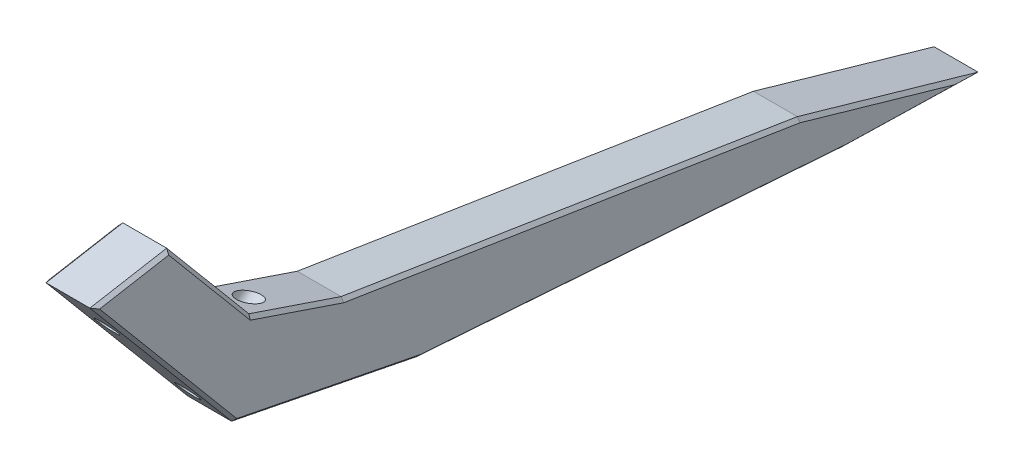
ISO-10303-21;
HEADER;
FILE_DESCRIPTION(('STEP AP214'),'2;1');
FILE_NAME('part.step','',(''),(''),'','','');
FILE_SCHEMA(('AUTOMOTIVE_DESIGN { 1 0 10303 214 1 1 1 1 }'));
ENDSEC;
DATA;
#1=APPLICATION_CONTEXT('core data for automotive mechanical design processes');
#2=APPLICATION_PROTOCOL_DEFINITION('international standard','automotive_design',2000,#1);
#3=PRODUCT_CONTEXT('',#1,'mechanical');
#4=PRODUCT('Part','Part','',(#3));
#5=PRODUCT_RELATED_PRODUCT_CATEGORY('part','',(#4));
#6=PRODUCT_DEFINITION_FORMATION('','',#4);
#7=PRODUCT_DEFINITION_CONTEXT('part definition',#1,'design');
#8=PRODUCT_DEFINITION('design','',#6,#7);
#9=PRODUCT_DEFINITION_SHAPE('','',#8);
#10=(LENGTH_UNIT() NAMED_UNIT(*) SI_UNIT(.MILLI.,.METRE.));
#11=(NAMED_UNIT(*) PLANE_ANGLE_UNIT() SI_UNIT($,.RADIAN.));
#12=(NAMED_UNIT(*) SI_UNIT($,.STERADIAN.) SOLID_ANGLE_UNIT());
#13=UNCERTAINTY_MEASURE_WITH_UNIT(LENGTH_MEASURE(1.E-05),#10,'distance_accuracy_value','');
#14=(GEOMETRIC_REPRESENTATION_CONTEXT(3) GLOBAL_UNCERTAINTY_ASSIGNED_CONTEXT((#13)) GLOBAL_UNIT_ASSIGNED_CONTEXT((#10,
#11,#12)) REPRESENTATION_CONTEXT('',''));
#15=CARTESIAN_POINT('',(0.,0.,0.));
#16=DIRECTION('',(0.,0.,1.));
#17=DIRECTION('',(1.,0.,0.));
#18=AXIS2_PLACEMENT_3D('',#15,#16,#17);
#19=CARTESIAN_POINT('',(-4.7625,12.7,-201.162314893091));
#20=DIRECTION('',(0.,-0.980995277303006,0.194031610592704));
#21=DIRECTION('',(0.,-0.194031610592704,-0.980995277303006));
#22=AXIS2_PLACEMENT_3D('',#19,#20,#21);
#23=PLANE('',#22);
#24=DIRECTION('',(1.,0.,0.));
#25=VECTOR('',#24,1.);
#26=CARTESIAN_POINT('',(-4.7625,5.81966451658387,-235.948278865011));
#27=LINE('',#26,#25);
#28=CARTESIAN_POINT('',(-4.12750000000001,5.81966451658387,-235.948278865011));
#29=VERTEX_POINT('',#28);
#30=CARTESIAN_POINT('',(4.12750000000001,5.81966451658387,-235.948278865011));
#31=VERTEX_POINT('',#30);
#32=EDGE_CURVE('E322',#29,#31,#27,.T.);
#33=ORIENTED_EDGE('',*,*,#32,.T.);
#34=DIRECTION('',(0.,0.194031610592704,0.980995277303006));
#35=VECTOR('',#34,1.);
#36=CARTESIAN_POINT('',(4.12750000000001,12.7,-201.162314893091));
#37=LINE('',#36,#35);
#38=CARTESIAN_POINT('',(4.12750000000001,12.7,-201.162314893091));
#39=VERTEX_POINT('',#38);
#40=EDGE_CURVE('E232',#31,#39,#37,.T.);
#41=ORIENTED_EDGE('',*,*,#40,.T.);
#42=DIRECTION('',(1.,0.,0.));
#43=VECTOR('',#42,1.);
#44=CARTESIAN_POINT('',(-4.7625,12.7,-201.162314893091));
#45=LINE('',#44,#43);
#46=CARTESIAN_POINT('',(-4.1275,12.7,-201.162314893091));
#47=VERTEX_POINT('',#46);
#48=EDGE_CURVE('E187',#47,#39,#45,.T.);
#49=ORIENTED_EDGE('',*,*,#48,.F.);
#50=DIRECTION('',(0.,-0.194031610592704,-0.980995277303006));
#51=VECTOR('',#50,1.);
#52=CARTESIAN_POINT('',(-4.1275,12.7,-201.162314893091));
#53=LINE('',#52,#51);
#54=EDGE_CURVE('E230',#47,#29,#53,.T.);
#55=ORIENTED_EDGE('',*,*,#54,.T.);
#56=EDGE_LOOP('',(#33,#41,#49,#55));
#57=FACE_BOUND('',#56,.T.);
#58=ADVANCED_FACE('F41',(#57),#23,.T.);
#59=CARTESIAN_POINT('',(-4.7625,44.45,-174.520901603212));
#60=DIRECTION('',(0.,-0.642787609686544,0.766044443118974));
#61=DIRECTION('',(0.,-0.766044443118974,-0.642787609686545));
#62=AXIS2_PLACEMENT_3D('',#59,#60,#61);
#63=PLANE('',#62);
#64=CARTESIAN_POINT('',(0.,35.6941120151501,-181.867963981929));
#65=DIRECTION('',(0.,-0.642787609686544,0.766044443118974));
#66=DIRECTION('',(0.,-0.766044443118974,-0.642787609686545));
#67=AXIS2_PLACEMENT_3D('',#64,#65,#66);
#68=CIRCLE('',#67,2.09549999999997);
#69=CARTESIAN_POINT('',(0.,34.0888658845943,-183.214925418027));
#70=VERTEX_POINT('',#69);
#71=EDGE_CURVE('E332',#70,#70,#68,.T.);
#72=ORIENTED_EDGE('',*,*,#71,.F.);
#73=EDGE_LOOP('',(#72));
#74=FACE_BOUND('',#73,.T.);
#75=CARTESIAN_POINT('',(0.,17.5643822138055,-197.080613571581));
#76=DIRECTION('',(0.,-0.642787609686544,0.766044443118974));
#77=DIRECTION('',(0.,-0.766044443118974,-0.642787609686545));
#78=AXIS2_PLACEMENT_3D('',#75,#76,#77);
#79=CIRCLE('',#78,2.09549999999997);
#80=CARTESIAN_POINT('',(0.,15.9591360832497,-198.427575007679));
#81=VERTEX_POINT('',#80);
#82=EDGE_CURVE('E328',#81,#81,#79,.T.);
#83=ORIENTED_EDGE('',*,*,#82,.F.);
#84=EDGE_LOOP('',(#83));
#85=FACE_BOUND('',#84,.T.);
#86=ORIENTED_EDGE('',*,*,#48,.T.);
#87=DIRECTION('',(0.,0.766044443118974,0.642787609686545));
#88=VECTOR('',#87,1.);
#89=CARTESIAN_POINT('',(4.12750000000001,44.45,-174.520901603212));
#90=LINE('',#89,#88);
#91=CARTESIAN_POINT('',(4.1275,44.45,-174.520901603212));
#92=VERTEX_POINT('',#91);
#93=EDGE_CURVE('E174',#39,#92,#90,.T.);
#94=ORIENTED_EDGE('',*,*,#93,.T.);
#95=DIRECTION('',(1.,0.,0.));
#96=VECTOR('',#95,1.);
#97=CARTESIAN_POINT('',(-4.7625,44.45,-174.520901603212));
#98=LINE('',#97,#96);
#99=CARTESIAN_POINT('',(-4.12750000000001,44.45,-174.520901603212));
#100=VERTEX_POINT('',#99);
#101=EDGE_CURVE('E338',#100,#92,#98,.T.);
#102=ORIENTED_EDGE('',*,*,#101,.F.);
#103=DIRECTION('',(0.,-0.766044443118974,-0.642787609686545));
#104=VECTOR('',#103,1.);
#105=CARTESIAN_POINT('',(-4.12750000000001,44.45,-174.520901603212));
#106=LINE('',#105,#104);
#107=EDGE_CURVE('E193',#100,#47,#106,.T.);
#108=ORIENTED_EDGE('',*,*,#107,.T.);
#109=EDGE_LOOP('',(#86,#94,#102,#108));
#110=FACE_BOUND('',#109,.T.);
#111=ADVANCED_FACE('F372',(#74,#85,#110),#63,.T.);
#112=CARTESIAN_POINT('',(-4.7625,44.45,-174.520901603212));
#113=DIRECTION('',(0.,0.984807753012206,0.173648177666939));
#114=DIRECTION('',(0.,-0.173648177666939,0.984807753012206));
#115=AXIS2_PLACEMENT_3D('',#112,#113,#114);
#116=PLANE('',#115);
#117=ORIENTED_EDGE('',*,*,#101,.T.);
#118=DIRECTION('',(0.,0.173648177666939,-0.984807753012206));
#119=VECTOR('',#118,1.);
#120=CARTESIAN_POINT('',(4.1275,46.9964978818555,-188.962808744273));
#121=LINE('',#120,#119);
#122=CARTESIAN_POINT('',(4.12749999999999,46.9964978818555,-188.962808744273));
#123=VERTEX_POINT('',#122);
#124=EDGE_CURVE('E203',#92,#123,#121,.T.);
#125=ORIENTED_EDGE('',*,*,#124,.T.);
#126=DIRECTION('',(1.,0.,0.));
#127=VECTOR('',#126,1.);
#128=CARTESIAN_POINT('',(-4.7625,46.9964978818555,-188.962808744273));
#129=LINE('',#128,#127);
#130=CARTESIAN_POINT('',(-4.1275,46.9964978818555,-188.962808744273));
#131=VERTEX_POINT('',#130);
#132=EDGE_CURVE('E341',#131,#123,#129,.T.);
#133=ORIENTED_EDGE('',*,*,#132,.F.);
#134=DIRECTION('',(0.,-0.173648177666939,0.984807753012206));
#135=VECTOR('',#134,1.);
#136=CARTESIAN_POINT('',(-4.1275,44.45,-174.520901603212));
#137=LINE('',#136,#135);
#138=EDGE_CURVE('E201',#131,#100,#137,.T.);
#139=ORIENTED_EDGE('',*,*,#138,.T.);
#140=EDGE_LOOP('',(#117,#125,#133,#139));
#141=FACE_BOUND('',#140,.T.);
#142=ADVANCED_FACE('F375',(#141),#116,.T.);
#143=CARTESIAN_POINT('',(-4.7625,46.9964978818555,-188.962808744273));
#144=DIRECTION('',(0.,0.642787609686544,-0.766044443118974));
#145=DIRECTION('',(0.,0.766044443118974,0.642787609686544));
#146=AXIS2_PLACEMENT_3D('',#143,#144,#145);
#147=PLANE('',#146);
#148=CARTESIAN_POINT('',(0.,43.8575146581693,-191.59672840954));
#149=DIRECTION('',(0.,0.642787609686544,-0.766044443118974));
#150=DIRECTION('',(0.,0.766044443118974,0.642787609686544));
#151=AXIS2_PLACEMENT_3D('',#148,#149,#150);
#152=CIRCLE('',#151,2.09549999999997);
#153=CARTESIAN_POINT('',(0.,45.462760788725,-190.249766973442));
#154=VERTEX_POINT('',#153);
#155=EDGE_CURVE('E331',#154,#154,#152,.T.);
#156=ORIENTED_EDGE('',*,*,#155,.F.);
#157=EDGE_LOOP('',(#156));
#158=FACE_BOUND('',#157,.T.);
#159=ORIENTED_EDGE('',*,*,#132,.T.);
#160=DIRECTION('',(0.,-0.766044443118974,-0.642787609686544));
#161=VECTOR('',#160,1.);
#162=CARTESIAN_POINT('',(4.12749999999999,28.5728147784951,-204.42211444123));
#163=LINE('',#162,#161);
#164=CARTESIAN_POINT('',(4.12750000000001,28.5728147784951,-204.42211444123));
#165=VERTEX_POINT('',#164);
#166=EDGE_CURVE('E208',#123,#165,#163,.T.);
#167=ORIENTED_EDGE('',*,*,#166,.T.);
#168=DIRECTION('',(1.,0.,0.));
#169=VECTOR('',#168,1.);
#170=CARTESIAN_POINT('',(-4.7625,28.5728147784951,-204.42211444123));
#171=LINE('',#170,#169);
#172=CARTESIAN_POINT('',(-4.1275,28.5728147784951,-204.42211444123));
#173=VERTEX_POINT('',#172);
#174=EDGE_CURVE('E335',#173,#165,#171,.T.);
#175=ORIENTED_EDGE('',*,*,#174,.F.);
#176=DIRECTION('',(0.,0.766044443118974,0.642787609686544));
#177=VECTOR('',#176,1.);
#178=CARTESIAN_POINT('',(-4.1275,46.9964978818555,-188.962808744273));
#179=LINE('',#178,#177);
#180=EDGE_CURVE('E205',#173,#131,#179,.T.);
#181=ORIENTED_EDGE('',*,*,#180,.T.);
#182=EDGE_LOOP('',(#159,#167,#175,#181));
#183=FACE_BOUND('',#182,.T.);
#184=ADVANCED_FACE('F383',(#158,#183),#147,.T.);
#185=CARTESIAN_POINT('',(-4.7625,28.5728147784951,-204.42211444123));
#186=DIRECTION('',(0.,0.947276519413052,-0.320417221398436));
#187=DIRECTION('',(0.,0.320417221398436,0.947276519413052));
#188=AXIS2_PLACEMENT_3D('',#185,#186,#187);
#189=PLANE('',#188);
#190=ORIENTED_EDGE('',*,*,#174,.T.);
#191=DIRECTION('',(0.,-0.320417221398436,-0.947276519413052));
#192=VECTOR('',#191,1.);
#193=CARTESIAN_POINT('',(4.12750000000001,22.7001972652866,-221.783830061499));
#194=LINE('',#193,#192);
#195=CARTESIAN_POINT('',(4.12750000000001,22.7001972652866,-221.783830061499));
#196=VERTEX_POINT('',#195);
#197=EDGE_CURVE('E212',#165,#196,#194,.T.);
#198=ORIENTED_EDGE('',*,*,#197,.T.);
#199=DIRECTION('',(1.,0.,0.));
#200=VECTOR('',#199,1.);
#201=CARTESIAN_POINT('',(-4.7625,22.7001972652866,-221.783830061499));
#202=LINE('',#201,#200);
#203=CARTESIAN_POINT('',(-4.1275,22.7001972652866,-221.783830061499));
#204=VERTEX_POINT('',#203);
#205=EDGE_CURVE('E318',#204,#196,#202,.T.);
#206=ORIENTED_EDGE('',*,*,#205,.F.);
#207=DIRECTION('',(0.,0.320417221398436,0.947276519413052));
#208=VECTOR('',#207,1.);
#209=CARTESIAN_POINT('',(-4.1275,28.5728147784951,-204.42211444123));
#210=LINE('',#209,#208);
#211=EDGE_CURVE('E210',#204,#173,#210,.T.);
#212=ORIENTED_EDGE('',*,*,#211,.T.);
#213=EDGE_LOOP('',(#190,#198,#206,#212));
#214=FACE_BOUND('',#213,.T.);
#215=CARTESIAN_POINT('',(0.,27.1799397090841,-208.539988761375));
#216=DIRECTION('',(0.,0.947276519413052,-0.320417221398436));
#217=DIRECTION('',(0.,-0.320417221398436,-0.947276519413052));
#218=AXIS2_PLACEMENT_3D('',#215,#216,#217);
#219=ELLIPSE('',#218,2.45273771198839,2.09549999999997);
#220=CARTESIAN_POINT('',(0.,26.3940403065896,-210.863409604221));
#221=VERTEX_POINT('',#220);
#222=EDGE_CURVE('E325',#221,#221,#219,.T.);
#223=ORIENTED_EDGE('',*,*,#222,.F.);
#224=EDGE_LOOP('',(#223));
#225=FACE_BOUND('',#224,.T.);
#226=ADVANCED_FACE('F400',(#214,#225),#189,.T.);
#227=CARTESIAN_POINT('',(-4.7625,0.,0.));
#228=DIRECTION('',(-1.,0.,0.));
#229=DIRECTION('',(0.,0.,1.));
#230=AXIS2_PLACEMENT_3D('',#227,#228,#229);
#231=PLANE('',#230);
#232=DIRECTION('',(0.,0.173648177666939,-0.984807753012206));
#233=VECTOR('',#232,1.);
#234=CARTESIAN_POINT('',(-4.7625,12.6394836839747,2.22868199570928));
#235=LINE('',#234,#233);
#236=CARTESIAN_POINT('',(-4.7625,44.0156344179764,-175.71431123161));
#237=VERTEX_POINT('',#236);
#238=CARTESIAN_POINT('',(-4.7625,46.3074825116463,-188.712027658565));
#239=VERTEX_POINT('',#238);
#240=EDGE_CURVE('E51',#237,#239,#235,.T.);
#241=ORIENTED_EDGE('',*,*,#240,.T.);
#242=DIRECTION('',(0.,-0.766044443118974,-0.642787609686544));
#243=VECTOR('',#242,1.);
#244=CARTESIAN_POINT('',(-4.7625,112.055670242983,-133.542747582625));
#245=LINE('',#244,#243);
#246=CARTESIAN_POINT('',(-4.7625,28.02831674034,-204.050068915497));
#247=VERTEX_POINT('',#246);
#248=EDGE_CURVE('E11',#239,#247,#245,.T.);
#249=ORIENTED_EDGE('',*,*,#248,.T.);
#250=DIRECTION('',(0.,-0.320417221398436,-0.947276519413052));
#251=VECTOR('',#250,1.);
#252=CARTESIAN_POINT('',(-4.7625,87.0847620517396,-29.4565070609496));
#253=LINE('',#252,#251);
#254=CARTESIAN_POINT('',(-4.7625,22.0814336021355,-221.631342281292));
#255=VERTEX_POINT('',#254);
#256=EDGE_CURVE('E234',#247,#255,#253,.T.);
#257=ORIENTED_EDGE('',*,*,#256,.T.);
#258=DIRECTION('',(0.,-0.156434465040224,-0.987688340595139));
#259=VECTOR('',#258,1.);
#260=CARTESIAN_POINT('',(-4.7625,55.7849880848163,-8.83547411632416));
#261=LINE('',#260,#259);
#262=CARTESIAN_POINT('',(-4.7625,8.48965987821422,-307.446424217825));
#263=VERTEX_POINT('',#262);
#264=EDGE_CURVE('E236',#255,#263,#261,.T.);
#265=ORIENTED_EDGE('',*,*,#264,.T.);
#266=DIRECTION('',(0.,-0.275637355816993,-0.961261695938321));
#267=VECTOR('',#266,1.);
#268=CARTESIAN_POINT('',(-4.7625,89.3055413437927,-25.6079519030244));
#269=LINE('',#268,#267);
#270=CARTESIAN_POINT('',(-4.7625,0.123962627267428,-336.621077643577));
#271=VERTEX_POINT('',#270);
#272=EDGE_CURVE('E238',#263,#271,#269,.T.);
#273=ORIENTED_EDGE('',*,*,#272,.T.);
#274=DIRECTION('',(0.,0.0249921911602031,0.999687646408123));
#275=VECTOR('',#274,1.);
#276=CARTESIAN_POINT('',(-4.7625,8.53415572103122,-0.213353893025781));
#277=LINE('',#276,#275);
#278=CARTESIAN_POINT('',(-4.7625,0.634425293464233,-316.202570995705));
#279=VERTEX_POINT('',#278);
#280=EDGE_CURVE('E240',#271,#279,#277,.T.);
#281=ORIENTED_EDGE('',*,*,#280,.T.);
#282=DIRECTION('',(0.,0.072353128539971,0.997379077778594));
#283=VECTOR('',#282,1.);
#284=CARTESIAN_POINT('',(-4.7625,23.4493872553032,-1.70109496786852));
#285=LINE('',#284,#283);
#286=CARTESIAN_POINT('',(-4.7625,6.45017446397072,-236.033175956112));
#287=VERTEX_POINT('',#286);
#288=EDGE_CURVE('E242',#279,#287,#285,.T.);
#289=ORIENTED_EDGE('',*,*,#288,.T.);
#290=DIRECTION('',(0.,0.194031610592704,0.980995277303006));
#291=VECTOR('',#290,1.);
#292=CARTESIAN_POINT('',(-4.7625,51.1348575266767,-10.1139923839459));
#293=LINE('',#292,#291);
#294=CARTESIAN_POINT('',(-4.7625,13.2795285736584,-201.504966309403));
#295=VERTEX_POINT('',#294);
#296=EDGE_CURVE('E244',#287,#295,#293,.T.);
#297=ORIENTED_EDGE('',*,*,#296,.T.);
#298=DIRECTION('',(0.,0.766044443118974,0.642787609686545));
#299=VECTOR('',#298,1.);
#300=CARTESIAN_POINT('',(-4.7625,104.708607864266,-124.786859597775));
#301=LINE('',#300,#299);
#302=EDGE_CURVE('E62',#295,#237,#301,.T.);
#303=ORIENTED_EDGE('',*,*,#302,.T.);
#304=EDGE_LOOP('',(#241,#249,#257,#265,#273,#281,#289,#297,#303));
#305=FACE_BOUND('',#304,.T.);
#306=ADVANCED_FACE('F388',(#305),#231,.T.);
#307=CARTESIAN_POINT('',(4.7625,0.,0.));
#308=DIRECTION('',(-1.,0.,0.));
#309=DIRECTION('',(0.,0.,1.));
#310=AXIS2_PLACEMENT_3D('',#307,#308,#309);
#311=PLANE('',#310);
#312=DIRECTION('',(0.,-0.173648177666939,0.984807753012206));
#313=VECTOR('',#312,1.);
#314=CARTESIAN_POINT('',(4.7625,43.8246470768372,-174.63116819603));
#315=LINE('',#314,#313);
#316=CARTESIAN_POINT('',(4.7625,46.3074825116464,-188.712027658565));
#317=VERTEX_POINT('',#316);
#318=CARTESIAN_POINT('',(4.7625,44.0156344179764,-175.71431123161));
#319=VERTEX_POINT('',#318);
#320=EDGE_CURVE('E191',#317,#319,#315,.T.);
#321=ORIENTED_EDGE('',*,*,#320,.T.);
#322=DIRECTION('',(0.,-0.766044443118974,-0.642787609686545));
#323=VECTOR('',#322,1.);
#324=CARTESIAN_POINT('',(4.7625,13.108170132151,-201.648753114471));
#325=LINE('',#324,#323);
#326=CARTESIAN_POINT('',(4.7625,13.2795285736584,-201.504966309403));
#327=VERTEX_POINT('',#326);
#328=EDGE_CURVE('E172',#319,#327,#325,.T.);
#329=ORIENTED_EDGE('',*,*,#328,.T.);
#330=DIRECTION('',(0.,-0.194031610592704,-0.980995277303006));
#331=VECTOR('',#330,1.);
#332=CARTESIAN_POINT('',(4.7625,6.44259651767127,-236.071488937738));
#333=LINE('',#332,#331);
#334=CARTESIAN_POINT('',(4.7625,6.4501744639707,-236.033175956112));
#335=VERTEX_POINT('',#334);
#336=EDGE_CURVE('E180',#327,#335,#333,.T.);
#337=ORIENTED_EDGE('',*,*,#336,.T.);
#338=DIRECTION('',(0.,-0.072353128539971,-0.997379077778594));
#339=VECTOR('',#338,1.);
#340=CARTESIAN_POINT('',(4.7625,0.633335714389414,-316.217590710743));
#341=LINE('',#340,#339);
#342=CARTESIAN_POINT('',(4.7625,0.634425293464216,-316.202570995705));
#343=VERTEX_POINT('',#342);
#344=EDGE_CURVE('E186',#335,#343,#341,.T.);
#345=ORIENTED_EDGE('',*,*,#344,.T.);
#346=DIRECTION('',(0.,-0.0249921911602031,-0.999687646408123));
#347=VECTOR('',#346,1.);
#348=CARTESIAN_POINT('',(4.7625,-0.000198344530835434,-341.587516515507));
#349=LINE('',#348,#347);
#350=CARTESIAN_POINT('',(4.7625,0.123962627267406,-336.621077643577));
#351=VERTEX_POINT('',#350);
#352=EDGE_CURVE('E351',#343,#351,#349,.T.);
#353=ORIENTED_EDGE('',*,*,#352,.T.);
#354=DIRECTION('',(0.,0.275637355816993,0.961261695938321));
#355=VECTOR('',#354,1.);
#356=CARTESIAN_POINT('',(4.7625,8.50036515455134,-307.409090482501));
#357=LINE('',#356,#355);
#358=CARTESIAN_POINT('',(4.7625,8.48965987821423,-307.446424217825));
#359=VERTEX_POINT('',#358);
#360=EDGE_CURVE('E353',#351,#359,#357,.T.);
#361=ORIENTED_EDGE('',*,*,#360,.T.);
#362=DIRECTION('',(0.,0.156434465040224,0.987688340595139));
#363=VECTOR('',#362,1.);
#364=CARTESIAN_POINT('',(4.7625,22.0730151690087,-221.684494176198));
#365=LINE('',#364,#363);
#366=CARTESIAN_POINT('',(4.7625,22.0814336021355,-221.631342281292));
#367=VERTEX_POINT('',#366);
#368=EDGE_CURVE('E355',#359,#367,#365,.T.);
#369=ORIENTED_EDGE('',*,*,#368,.T.);
#370=DIRECTION('',(0.,0.320417221398436,0.947276519413052));
#371=VECTOR('',#370,1.);
#372=CARTESIAN_POINT('',(4.7625,27.9712941886678,-204.218649505642));
#373=LINE('',#372,#371);
#374=CARTESIAN_POINT('',(4.7625,28.02831674034,-204.050068915497));
#375=VERTEX_POINT('',#374);
#376=EDGE_CURVE('E357',#367,#375,#373,.T.);
#377=ORIENTED_EDGE('',*,*,#376,.T.);
#378=DIRECTION('',(0.,0.766044443118974,0.642787609686544));
#379=VECTOR('',#378,1.);
#380=CARTESIAN_POINT('',(4.7625,46.5883277497045,-188.476370522892));
#381=LINE('',#380,#379);
#382=EDGE_CURVE('E196',#375,#317,#381,.T.);
#383=ORIENTED_EDGE('',*,*,#382,.T.);
#384=EDGE_LOOP('',(#321,#329,#337,#345,#353,#361,#369,#377,#383));
#385=FACE_BOUND('',#384,.T.);
#386=ADVANCED_FACE('F189',(#385),#311,.F.);
#387=CARTESIAN_POINT('',(0.,-115.727288721338,-38.2297858717411));
#388=DIRECTION('',(0.,0.642787609686544,-0.766044443118974));
#389=DIRECTION('',(0.,0.766044443118974,0.642787609686544));
#390=AXIS2_PLACEMENT_3D('',#387,#388,#389);
#391=CYLINDRICAL_SURFACE('',#390,2.09549999999997);
#392=ORIENTED_EDGE('',*,*,#82,.T.);
#393=EDGE_LOOP('',(#392));
#394=FACE_BOUND('',#393,.T.);
#395=ORIENTED_EDGE('',*,*,#222,.T.);
#396=EDGE_LOOP('',(#395));
#397=FACE_BOUND('',#396,.T.);
#398=ADVANCED_FACE('F618',(#394,#397),#391,.F.);
#399=CARTESIAN_POINT('',(0.,-97.5975589199929,-23.0171362820889));
#400=DIRECTION('',(0.,0.642787609686544,-0.766044443118974));
#401=DIRECTION('',(0.,0.766044443118974,0.642787609686544));
#402=AXIS2_PLACEMENT_3D('',#399,#400,#401);
#403=CYLINDRICAL_SURFACE('',#402,2.09549999999997);
#404=ORIENTED_EDGE('',*,*,#71,.T.);
#405=EDGE_LOOP('',(#404));
#406=FACE_BOUND('',#405,.T.);
#407=ORIENTED_EDGE('',*,*,#155,.T.);
#408=EDGE_LOOP('',(#407));
#409=FACE_BOUND('',#408,.T.);
#410=ADVANCED_FACE('F606',(#406,#409),#403,.F.);
#411=CARTESIAN_POINT('',(-126.802052573392,5.81966451658387,-235.948278865011));
#412=DIRECTION('',(0.,-0.997379077778594,0.072353128539971));
#413=DIRECTION('',(0.,-0.072353128539971,-0.997379077778594));
#414=AXIS2_PLACEMENT_3D('',#411,#412,#413);
#415=PLANE('',#414);
#416=DIRECTION('',(1.,0.,0.));
#417=VECTOR('',#416,1.);
#418=CARTESIAN_POINT('',(-126.802052573392,0.,-316.17164647412));
#419=LINE('',#418,#417);
#420=CARTESIAN_POINT('',(-4.12750000000001,0.,-316.17164647412));
#421=VERTEX_POINT('',#420);
#422=CARTESIAN_POINT('',(4.12750000000001,0.,-316.17164647412));
#423=VERTEX_POINT('',#422);
#424=EDGE_CURVE('E268',#421,#423,#419,.T.);
#425=ORIENTED_EDGE('',*,*,#424,.T.);
#426=DIRECTION('',(0.,0.072353128539971,0.997379077778594));
#427=VECTOR('',#426,1.);
#428=CARTESIAN_POINT('',(4.12750000000001,5.81966451658387,-235.948278865011));
#429=LINE('',#428,#427);
#430=EDGE_CURVE('E228',#423,#31,#429,.T.);
#431=ORIENTED_EDGE('',*,*,#430,.T.);
#432=ORIENTED_EDGE('',*,*,#32,.F.);
#433=DIRECTION('',(0.,-0.072353128539971,-0.997379077778594));
#434=VECTOR('',#433,1.);
#435=CARTESIAN_POINT('',(-4.12750000000001,5.81966451658387,-235.948278865011));
#436=LINE('',#435,#434);
#437=EDGE_CURVE('E226',#29,#421,#436,.T.);
#438=ORIENTED_EDGE('',*,*,#437,.T.);
#439=EDGE_LOOP('',(#425,#431,#432,#438));
#440=FACE_BOUND('',#439,.T.);
#441=ADVANCED_FACE('F596',(#440),#415,.T.);
#442=CARTESIAN_POINT('',(-126.802052573392,0.,-316.17164647412));
#443=DIRECTION('',(0.,-0.999687646408123,0.0249921911602031));
#444=DIRECTION('',(0.,-0.0249921911602031,-0.999687646408123));
#445=AXIS2_PLACEMENT_3D('',#442,#443,#444);
#446=PLANE('',#445);
#447=DIRECTION('',(1.,0.,0.));
#448=VECTOR('',#447,1.);
#449=CARTESIAN_POINT('',(-126.802052573392,-0.635,-341.57164647412));
#450=LINE('',#449,#448);
#451=CARTESIAN_POINT('',(-4.12750000000001,-0.635,-341.57164647412));
#452=VERTEX_POINT('',#451);
#453=CARTESIAN_POINT('',(4.12750000000001,-0.635,-341.57164647412));
#454=VERTEX_POINT('',#453);
#455=EDGE_CURVE('E308',#452,#454,#450,.T.);
#456=ORIENTED_EDGE('',*,*,#455,.T.);
#457=DIRECTION('',(0.,0.0249921911602031,0.999687646408123));
#458=VECTOR('',#457,1.);
#459=CARTESIAN_POINT('',(4.12750000000001,0.,-316.17164647412));
#460=LINE('',#459,#458);
#461=EDGE_CURVE('E224',#454,#423,#460,.T.);
#462=ORIENTED_EDGE('',*,*,#461,.T.);
#463=ORIENTED_EDGE('',*,*,#424,.F.);
#464=DIRECTION('',(0.,-0.0249921911602031,-0.999687646408123));
#465=VECTOR('',#464,1.);
#466=CARTESIAN_POINT('',(-4.12750000000001,0.,-316.17164647412));
#467=LINE('',#466,#465);
#468=EDGE_CURVE('E222',#421,#452,#467,.T.);
#469=ORIENTED_EDGE('',*,*,#468,.T.);
#470=EDGE_LOOP('',(#456,#462,#463,#469));
#471=FACE_BOUND('',#470,.T.);
#472=ADVANCED_FACE('F307',(#471),#446,.T.);
#473=CARTESIAN_POINT('',(-126.802052573392,-0.635,-341.57164647412));
#474=DIRECTION('',(0.,0.961261695938321,-0.275637355816993));
#475=DIRECTION('',(0.,0.275637355816993,0.961261695938321));
#476=AXIS2_PLACEMENT_3D('',#473,#474,#475);
#477=PLANE('',#476);
#478=DIRECTION('',(1.,0.,0.));
#479=VECTOR('',#478,1.);
#480=CARTESIAN_POINT('',(-126.802052573392,9.1107663314722,-307.584120203445));
#481=LINE('',#480,#479);
#482=CARTESIAN_POINT('',(-4.12750000000001,9.1107663314722,-307.584120203445));
#483=VERTEX_POINT('',#482);
#484=CARTESIAN_POINT('',(4.12750000000001,9.1107663314722,-307.584120203445));
#485=VERTEX_POINT('',#484);
#486=EDGE_CURVE('E316',#483,#485,#481,.T.);
#487=ORIENTED_EDGE('',*,*,#486,.T.);
#488=DIRECTION('',(0.,-0.275637355816993,-0.961261695938321));
#489=VECTOR('',#488,1.);
#490=CARTESIAN_POINT('',(4.1275,-0.635000000000016,-341.57164647412));
#491=LINE('',#490,#489);
#492=EDGE_CURVE('E220',#485,#454,#491,.T.);
#493=ORIENTED_EDGE('',*,*,#492,.T.);
#494=ORIENTED_EDGE('',*,*,#455,.F.);
#495=DIRECTION('',(0.,0.275637355816993,0.961261695938321));
#496=VECTOR('',#495,1.);
#497=CARTESIAN_POINT('',(-4.12750000000001,-0.635,-341.57164647412));
#498=LINE('',#497,#496);
#499=EDGE_CURVE('E218',#452,#483,#498,.T.);
#500=ORIENTED_EDGE('',*,*,#499,.T.);
#501=EDGE_LOOP('',(#487,#493,#494,#500));
#502=FACE_BOUND('',#501,.T.);
#503=ADVANCED_FACE('F313',(#502),#477,.T.);
#504=CARTESIAN_POINT('',(-126.802052573392,9.1107663314722,-307.584120203445));
#505=DIRECTION('',(0.,0.987688340595139,-0.156434465040224));
#506=DIRECTION('',(0.,0.156434465040224,0.987688340595139));
#507=AXIS2_PLACEMENT_3D('',#504,#505,#506);
#508=PLANE('',#507);
#509=ORIENTED_EDGE('',*,*,#205,.T.);
#510=DIRECTION('',(0.,-0.156434465040224,-0.987688340595139));
#511=VECTOR('',#510,1.);
#512=CARTESIAN_POINT('',(4.12750000000001,9.1107663314722,-307.584120203445));
#513=LINE('',#512,#511);
#514=EDGE_CURVE('E216',#196,#485,#513,.T.);
#515=ORIENTED_EDGE('',*,*,#514,.T.);
#516=ORIENTED_EDGE('',*,*,#486,.F.);
#517=DIRECTION('',(0.,0.156434465040224,0.987688340595139));
#518=VECTOR('',#517,1.);
#519=CARTESIAN_POINT('',(-4.12750000000001,9.1107663314722,-307.584120203445));
#520=LINE('',#519,#518);
#521=EDGE_CURVE('E214',#483,#204,#520,.T.);
#522=ORIENTED_EDGE('',*,*,#521,.T.);
#523=EDGE_LOOP('',(#509,#515,#516,#522));
#524=FACE_BOUND('',#523,.T.);
#525=ADVANCED_FACE('F405',(#524),#508,.T.);
#526=CARTESIAN_POINT('',(4.7625,55.7849880848163,-8.83547411632416));
#527=DIRECTION('',(0.707106781186557,0.698401123333702,-0.110615871041231));
#528=DIRECTION('',(0.,-0.156434465040224,-0.987688340595139));
#529=AXIS2_PLACEMENT_3D('',#526,#527,#528);
#530=PLANE('',#529);
#531=DIRECTION('',(0.705840566185114,-0.687792904461912,0.169499308846157));
#532=VECTOR('',#531,1.);
#533=CARTESIAN_POINT('',(-3.80310560518911,30.428024942882,-223.688271706269));
#534=LINE('',#533,#532);
#535=EDGE_CURVE('E262',#367,#196,#534,.F.);
#536=ORIENTED_EDGE('',*,*,#535,.F.);
#537=ORIENTED_EDGE('',*,*,#368,.F.);
#538=DIRECTION('',(0.706446409480722,-0.69098964379434,0.153188715970747));
#539=VECTOR('',#538,1.);
#540=CARTESIAN_POINT('',(-4.18709052620125,17.2434369330805,-309.387089868855));
#541=LINE('',#540,#539);
#542=EDGE_CURVE('E265',#485,#359,#541,.T.);
#543=ORIENTED_EDGE('',*,*,#542,.F.);
#544=ORIENTED_EDGE('',*,*,#514,.F.);
#545=EDGE_LOOP('',(#536,#537,#543,#544));
#546=FACE_BOUND('',#545,.T.);
#547=ADVANCED_FACE('F409',(#546),#530,.T.);
#548=CARTESIAN_POINT('',(4.7625,89.3055413437927,-25.6079519030244));
#549=DIRECTION('',(0.707106781186557,0.679714663692859,-0.194905043446522));
#550=DIRECTION('',(0.,-0.275637355816993,-0.961261695938321));
#551=AXIS2_PLACEMENT_3D('',#548,#549,#550);
#552=PLANE('',#551);
#553=ORIENTED_EDGE('',*,*,#542,.T.);
#554=ORIENTED_EDGE('',*,*,#360,.F.);
#555=DIRECTION('',(0.125779863655242,0.150334198074204,0.980601374049748));
#556=VECTOR('',#555,1.);
#557=CARTESIAN_POINT('',(46.4140258714042,49.9065634226338,-11.8986434332953));
#558=LINE('',#557,#556);
#559=EDGE_CURVE('E259',#454,#351,#558,.T.);
#560=ORIENTED_EDGE('',*,*,#559,.F.);
#561=ORIENTED_EDGE('',*,*,#492,.F.);
#562=EDGE_LOOP('',(#553,#554,#560,#561));
#563=FACE_BOUND('',#562,.T.);
#564=ADVANCED_FACE('F415',(#563),#552,.T.);
#565=CARTESIAN_POINT('',(4.7625,87.0847620517396,-29.4565070609496));
#566=DIRECTION('',(0.707106781186547,0.669825650535759,-0.226569190059785));
#567=DIRECTION('',(0.,-0.320417221398436,-0.947276519413052));
#568=AXIS2_PLACEMENT_3D('',#565,#566,#567);
#569=PLANE('',#568);
#570=ORIENTED_EDGE('',*,*,#535,.T.);
#571=ORIENTED_EDGE('',*,*,#197,.F.);
#572=DIRECTION('',(0.693618020014064,-0.59476165531763,0.406389733723187));
#573=VECTOR('',#572,1.);
#574=CARTESIAN_POINT('',(-10.0273757640802,40.7102983751426,-212.715434433886));
#575=LINE('',#574,#573);
#576=EDGE_CURVE('E256',#375,#165,#575,.F.);
#577=ORIENTED_EDGE('',*,*,#576,.F.);
#578=ORIENTED_EDGE('',*,*,#376,.F.);
#579=EDGE_LOOP('',(#570,#571,#577,#578));
#580=FACE_BOUND('',#579,.T.);
#581=ADVANCED_FACE('F412',(#580),#569,.T.);
#582=CARTESIAN_POINT('',(4.7625,8.53415572103121,-0.21335389302578));
#583=DIRECTION('',(0.707106781186555,-0.706885913843596,0.0176721478460899));
#584=DIRECTION('',(0.,0.0249921911602031,0.999687646408123));
#585=AXIS2_PLACEMENT_3D('',#582,#583,#584);
#586=PLANE('',#585);
#587=ORIENTED_EDGE('',*,*,#559,.T.);
#588=ORIENTED_EDGE('',*,*,#352,.F.);
#589=DIRECTION('',(0.707007380620846,0.706367503829532,-0.0344312834684765));
#590=VECTOR('',#589,1.);
#591=CARTESIAN_POINT('',(8.50048921058933,4.36903143817955,-316.384611197321));
#592=LINE('',#591,#590);
#593=EDGE_CURVE('E253',#423,#343,#592,.T.);
#594=ORIENTED_EDGE('',*,*,#593,.F.);
#595=ORIENTED_EDGE('',*,*,#461,.F.);
#596=EDGE_LOOP('',(#587,#588,#594,#595));
#597=FACE_BOUND('',#596,.T.);
#598=ADVANCED_FACE('F414',(#597),#586,.T.);
#599=CARTESIAN_POINT('',(4.7625,112.055670242983,-133.542747582625));
#600=DIRECTION('',(0.707106781186555,0.454519477672042,-0.541675220419693));
#601=DIRECTION('',(0.,-0.766044443118974,-0.642787609686544));
#602=AXIS2_PLACEMENT_3D('',#599,#600,#601);
#603=PLANE('',#602);
#604=ORIENTED_EDGE('',*,*,#576,.T.);
#605=ORIENTED_EDGE('',*,*,#166,.F.);
#606=DIRECTION('',(0.654653670707969,-0.71034085241202,0.25854292646125));
#607=VECTOR('',#606,1.);
#608=CARTESIAN_POINT('',(-16.4744628493446,69.3509373459128,-197.099159312895));
#609=LINE('',#608,#607);
#610=EDGE_CURVE('E250',#317,#123,#609,.F.);
#611=ORIENTED_EDGE('',*,*,#610,.F.);
#612=ORIENTED_EDGE('',*,*,#382,.F.);
#613=EDGE_LOOP('',(#604,#605,#611,#612));
#614=FACE_BOUND('',#613,.T.);
#615=ADVANCED_FACE('F364',(#614),#603,.T.);
#616=CARTESIAN_POINT('',(4.7625,23.4493872553032,-1.70109496786852));
#617=DIRECTION('',(0.707106781186553,-0.705253509310823,0.051161387830675));
#618=DIRECTION('',(0.,0.072353128539971,0.997379077778594));
#619=AXIS2_PLACEMENT_3D('',#616,#617,#618);
#620=PLANE('',#619);
#621=ORIENTED_EDGE('',*,*,#593,.T.);
#622=ORIENTED_EDGE('',*,*,#344,.F.);
#623=DIRECTION('',(0.706439021650729,0.701443827359069,-0.0944482172887447));
#624=VECTOR('',#623,1.);
#625=CARTESIAN_POINT('',(11.8312213744476,13.4689132701048,-236.978237188386));
#626=LINE('',#625,#624);
#627=EDGE_CURVE('E183',#31,#335,#626,.T.);
#628=ORIENTED_EDGE('',*,*,#627,.F.);
#629=ORIENTED_EDGE('',*,*,#430,.F.);
#630=EDGE_LOOP('',(#621,#622,#628,#629));
#631=FACE_BOUND('',#630,.T.);
#632=ADVANCED_FACE('F453',(#631),#620,.T.);
#633=CARTESIAN_POINT('',(4.7625,12.6394836839747,2.22868199570929));
#634=DIRECTION('',(0.707106781186555,0.69636424032001,0.122787803968978));
#635=DIRECTION('',(0.,0.173648177666939,-0.984807753012206));
#636=AXIS2_PLACEMENT_3D('',#633,#634,#635);
#637=PLANE('',#636);
#638=ORIENTED_EDGE('',*,*,#610,.T.);
#639=ORIENTED_EDGE('',*,*,#124,.F.);
#640=DIRECTION('',(0.447213595499947,-0.305912116060156,-0.840486631212899));
#641=VECTOR('',#640,1.);
#642=CARTESIAN_POINT('',(-57.8296768340864,86.8312050016957,-58.0794978517703));
#643=LINE('',#642,#641);
#644=EDGE_CURVE('E177',#319,#92,#643,.F.);
#645=ORIENTED_EDGE('',*,*,#644,.F.);
#646=ORIENTED_EDGE('',*,*,#320,.F.);
#647=EDGE_LOOP('',(#638,#639,#645,#646));
#648=FACE_BOUND('',#647,.T.);
#649=ADVANCED_FACE('F367',(#648),#637,.T.);
#650=CARTESIAN_POINT('',(4.7625,51.1348575266767,-10.1139923839459));
#651=DIRECTION('',(0.707106781186551,-0.693668412892929,0.137201067614648));
#652=DIRECTION('',(0.,0.194031610592704,0.980995277303006));
#653=AXIS2_PLACEMENT_3D('',#650,#651,#652);
#654=PLANE('',#653);
#655=ORIENTED_EDGE('',*,*,#627,.T.);
#656=ORIENTED_EDGE('',*,*,#336,.F.);
#657=DIRECTION('',(-0.686140401836438,-0.626201525048263,0.370247213352054));
#658=VECTOR('',#657,1.);
#659=CARTESIAN_POINT('',(-27.5937612008156,-16.2502004068552,-184.045251778632));
#660=LINE('',#659,#658);
#661=EDGE_CURVE('E168',#39,#327,#660,.F.);
#662=ORIENTED_EDGE('',*,*,#661,.F.);
#663=ORIENTED_EDGE('',*,*,#40,.F.);
#664=EDGE_LOOP('',(#655,#656,#662,#663));
#665=FACE_BOUND('',#664,.T.);
#666=ADVANCED_FACE('F181',(#665),#654,.T.);
#667=CARTESIAN_POINT('',(4.7625,104.708607864266,-124.786859597775));
#668=DIRECTION('',(0.707106781186563,-0.454519477672037,0.541675220419687));
#669=DIRECTION('',(0.,0.766044443118974,0.642787609686545));
#670=AXIS2_PLACEMENT_3D('',#667,#668,#669);
#671=PLANE('',#670);
#672=ORIENTED_EDGE('',*,*,#644,.T.);
#673=ORIENTED_EDGE('',*,*,#93,.F.);
#674=ORIENTED_EDGE('',*,*,#661,.T.);
#675=ORIENTED_EDGE('',*,*,#328,.F.);
#676=EDGE_LOOP('',(#672,#673,#674,#675));
#677=FACE_BOUND('',#676,.T.);
#678=ADVANCED_FACE('F170',(#677),#671,.T.);
#679=CARTESIAN_POINT('',(-4.12750000000001,0.,-316.17164647412));
#680=DIRECTION('',(0.707106781186563,0.706885913843587,-0.0176721478460897));
#681=DIRECTION('',(0.,-0.0249921911602031,-0.999687646408123));
#682=AXIS2_PLACEMENT_3D('',#679,#680,#681);
#683=PLANE('',#682);
#684=DIRECTION('',(-0.125779863655238,0.150334198074203,0.980601374049749));
#685=VECTOR('',#684,1.);
#686=CARTESIAN_POINT('',(-4.12750000000001,-0.635,-341.57164647412));
#687=LINE('',#686,#685);
#688=EDGE_CURVE('E287',#452,#271,#687,.T.);
#689=ORIENTED_EDGE('',*,*,#688,.F.);
#690=ORIENTED_EDGE('',*,*,#468,.F.);
#691=DIRECTION('',(-0.707007380620837,0.706367503829539,-0.0344312834685183));
#692=VECTOR('',#691,1.);
#693=CARTESIAN_POINT('',(-4.12750000000001,0.,-316.17164647412));
#694=LINE('',#693,#692);
#695=EDGE_CURVE('E46',#279,#421,#694,.F.);
#696=ORIENTED_EDGE('',*,*,#695,.F.);
#697=ORIENTED_EDGE('',*,*,#280,.F.);
#698=EDGE_LOOP('',(#689,#690,#696,#697));
#699=FACE_BOUND('',#698,.T.);
#700=ADVANCED_FACE('F44',(#699),#683,.F.);
#701=CARTESIAN_POINT('',(-4.12750000000001,5.81966451658387,-235.948278865011));
#702=DIRECTION('',(0.707106781186562,0.705253509310814,-0.0511613878306743));
#703=DIRECTION('',(0.,-0.072353128539971,-0.997379077778594));
#704=AXIS2_PLACEMENT_3D('',#701,#702,#703);
#705=PLANE('',#704);
#706=ORIENTED_EDGE('',*,*,#695,.T.);
#707=ORIENTED_EDGE('',*,*,#437,.F.);
#708=DIRECTION('',(-0.70643902165072,0.701443827359082,-0.0944482172887139));
#709=VECTOR('',#708,1.);
#710=CARTESIAN_POINT('',(-4.12750000000001,5.81966451658387,-235.948278865011));
#711=LINE('',#710,#709);
#712=EDGE_CURVE('E285',#287,#29,#711,.F.);
#713=ORIENTED_EDGE('',*,*,#712,.F.);
#714=ORIENTED_EDGE('',*,*,#288,.F.);
#715=EDGE_LOOP('',(#706,#707,#713,#714));
#716=FACE_BOUND('',#715,.T.);
#717=ADVANCED_FACE('F298',(#716),#705,.F.);
#718=CARTESIAN_POINT('',(-4.12750000000001,-0.635,-341.57164647412));
#719=DIRECTION('',(0.707106781186572,-0.679714663692844,0.194905043446518));
#720=DIRECTION('',(0.,0.275637355816993,0.961261695938321));
#721=AXIS2_PLACEMENT_3D('',#718,#719,#720);
#722=PLANE('',#721);
#723=ORIENTED_EDGE('',*,*,#688,.T.);
#724=ORIENTED_EDGE('',*,*,#272,.F.);
#725=DIRECTION('',(-0.706446409480711,-0.690989643794324,0.153188715970873));
#726=VECTOR('',#725,1.);
#727=CARTESIAN_POINT('',(-4.12750000000001,9.11076633147219,-307.584120203445));
#728=LINE('',#727,#726);
#729=EDGE_CURVE('E282',#483,#263,#728,.T.);
#730=ORIENTED_EDGE('',*,*,#729,.F.);
#731=ORIENTED_EDGE('',*,*,#499,.F.);
#732=EDGE_LOOP('',(#723,#724,#730,#731));
#733=FACE_BOUND('',#732,.T.);
#734=ADVANCED_FACE('F511',(#733),#722,.F.);
#735=CARTESIAN_POINT('',(-4.1275,12.7,-201.162314893091));
#736=DIRECTION('',(0.707106781186559,0.693668412892922,-0.137201067614646));
#737=DIRECTION('',(0.,-0.194031610592704,-0.980995277303006));
#738=AXIS2_PLACEMENT_3D('',#735,#736,#737);
#739=PLANE('',#738);
#740=ORIENTED_EDGE('',*,*,#712,.T.);
#741=ORIENTED_EDGE('',*,*,#54,.F.);
#742=DIRECTION('',(-0.686140401836434,0.626201525048278,-0.370247213352037));
#743=VECTOR('',#742,1.);
#744=CARTESIAN_POINT('',(-4.12750000000001,12.7,-201.162314893091));
#745=LINE('',#744,#743);
#746=EDGE_CURVE('E279',#295,#47,#745,.F.);
#747=ORIENTED_EDGE('',*,*,#746,.F.);
#748=ORIENTED_EDGE('',*,*,#296,.F.);
#749=EDGE_LOOP('',(#740,#741,#747,#748));
#750=FACE_BOUND('',#749,.T.);
#751=ADVANCED_FACE('F505',(#750),#739,.F.);
#752=CARTESIAN_POINT('',(-4.12750000000001,9.1107663314722,-307.584120203445));
#753=DIRECTION('',(0.707106781186564,-0.698401123333694,0.11061587104123));
#754=DIRECTION('',(0.,0.156434465040224,0.987688340595139));
#755=AXIS2_PLACEMENT_3D('',#752,#753,#754);
#756=PLANE('',#755);
#757=ORIENTED_EDGE('',*,*,#729,.T.);
#758=ORIENTED_EDGE('',*,*,#264,.F.);
#759=DIRECTION('',(-0.705840566185106,-0.687792904461919,0.16949930884616));
#760=VECTOR('',#759,1.);
#761=CARTESIAN_POINT('',(-0.459687229632065,26.2742276047277,-222.664612152155));
#762=LINE('',#761,#760);
#763=EDGE_CURVE('E276',#204,#255,#762,.T.);
#764=ORIENTED_EDGE('',*,*,#763,.F.);
#765=ORIENTED_EDGE('',*,*,#521,.F.);
#766=EDGE_LOOP('',(#757,#758,#764,#765));
#767=FACE_BOUND('',#766,.T.);
#768=ADVANCED_FACE('F393',(#767),#756,.F.);
#769=CARTESIAN_POINT('',(-4.1275,44.45,-174.520901603212));
#770=DIRECTION('',(0.707106781186563,0.454519477672037,-0.541675220419687));
#771=DIRECTION('',(0.,-0.766044443118974,-0.642787609686545));
#772=AXIS2_PLACEMENT_3D('',#769,#770,#771);
#773=PLANE('',#772);
#774=ORIENTED_EDGE('',*,*,#746,.T.);
#775=ORIENTED_EDGE('',*,*,#107,.F.);
#776=DIRECTION('',(-0.447213595499943,-0.305912116060162,-0.840486631212899));
#777=VECTOR('',#776,1.);
#778=CARTESIAN_POINT('',(-4.1275,44.45,-174.520901603212));
#779=LINE('',#778,#777);
#780=EDGE_CURVE('E273',#237,#100,#779,.F.);
#781=ORIENTED_EDGE('',*,*,#780,.F.);
#782=ORIENTED_EDGE('',*,*,#302,.F.);
#783=EDGE_LOOP('',(#774,#775,#781,#782));
#784=FACE_BOUND('',#783,.T.);
#785=ADVANCED_FACE('F493',(#784),#773,.F.);
#786=CARTESIAN_POINT('',(-4.1275,28.5728147784951,-204.42211444123));
#787=DIRECTION('',(0.707106781186555,-0.669825650535752,0.226569190059783));
#788=DIRECTION('',(0.,0.320417221398436,0.947276519413052));
#789=AXIS2_PLACEMENT_3D('',#786,#787,#788);
#790=PLANE('',#789);
#791=ORIENTED_EDGE('',*,*,#763,.T.);
#792=ORIENTED_EDGE('',*,*,#256,.F.);
#793=DIRECTION('',(0.69361802001406,0.594761655317649,-0.406389733723166));
#794=VECTOR('',#793,1.);
#795=CARTESIAN_POINT('',(-0.884699020828961,31.3534427647726,-206.322066559567));
#796=LINE('',#795,#794);
#797=EDGE_CURVE('E271',#173,#247,#796,.F.);
#798=ORIENTED_EDGE('',*,*,#797,.F.);
#799=ORIENTED_EDGE('',*,*,#211,.F.);
#800=EDGE_LOOP('',(#791,#792,#798,#799));
#801=FACE_BOUND('',#800,.T.);
#802=ADVANCED_FACE('F397',(#801),#790,.F.);
#803=CARTESIAN_POINT('',(-4.1275,44.45,-174.520901603212));
#804=DIRECTION('',(0.707106781186563,-0.696364240320003,-0.122787803968977));
#805=DIRECTION('',(0.,-0.173648177666939,0.984807753012206));
#806=AXIS2_PLACEMENT_3D('',#803,#804,#805);
#807=PLANE('',#806);
#808=ORIENTED_EDGE('',*,*,#780,.T.);
#809=ORIENTED_EDGE('',*,*,#138,.F.);
#810=DIRECTION('',(-0.654653670707965,-0.710340852412028,0.258542926461238));
#811=VECTOR('',#810,1.);
#812=CARTESIAN_POINT('',(-7.75607142857131,43.0592671949461,-187.529773968799));
#813=LINE('',#812,#811);
#814=EDGE_CURVE('E269',#239,#131,#813,.F.);
#815=ORIENTED_EDGE('',*,*,#814,.F.);
#816=ORIENTED_EDGE('',*,*,#240,.F.);
#817=EDGE_LOOP('',(#808,#809,#815,#816));
#818=FACE_BOUND('',#817,.T.);
#819=ADVANCED_FACE('F379',(#818),#807,.F.);
#820=CARTESIAN_POINT('',(-4.1275,46.9964978818555,-188.962808744273));
#821=DIRECTION('',(0.707106781186555,-0.454519477672042,0.541675220419693));
#822=DIRECTION('',(0.,0.766044443118974,0.642787609686544));
#823=AXIS2_PLACEMENT_3D('',#820,#821,#822);
#824=PLANE('',#823);
#825=ORIENTED_EDGE('',*,*,#797,.T.);
#826=ORIENTED_EDGE('',*,*,#248,.F.);
#827=ORIENTED_EDGE('',*,*,#814,.T.);
#828=ORIENTED_EDGE('',*,*,#180,.F.);
#829=EDGE_LOOP('',(#825,#826,#827,#828));
#830=FACE_BOUND('',#829,.T.);
#831=ADVANCED_FACE('F386',(#830),#824,.F.);
#832=CLOSED_SHELL('',(#58,#111,#142,#184,#226,#306,#386,#398,#410,#441,#472,#503,#525,#547,#564,
#581,#598,#615,#632,#649,#666,#678,#700,#717,#734,#751,#768,#785,#802,#819,#831));
#833=MANIFOLD_SOLID_BREP('B2',#832);
#834=ADVANCED_BREP_SHAPE_REPRESENTATION('',(#18,#833),#14);
#835=SHAPE_DEFINITION_REPRESENTATION(#9,#834);
ENDSEC;
END-ISO-10303-21;
